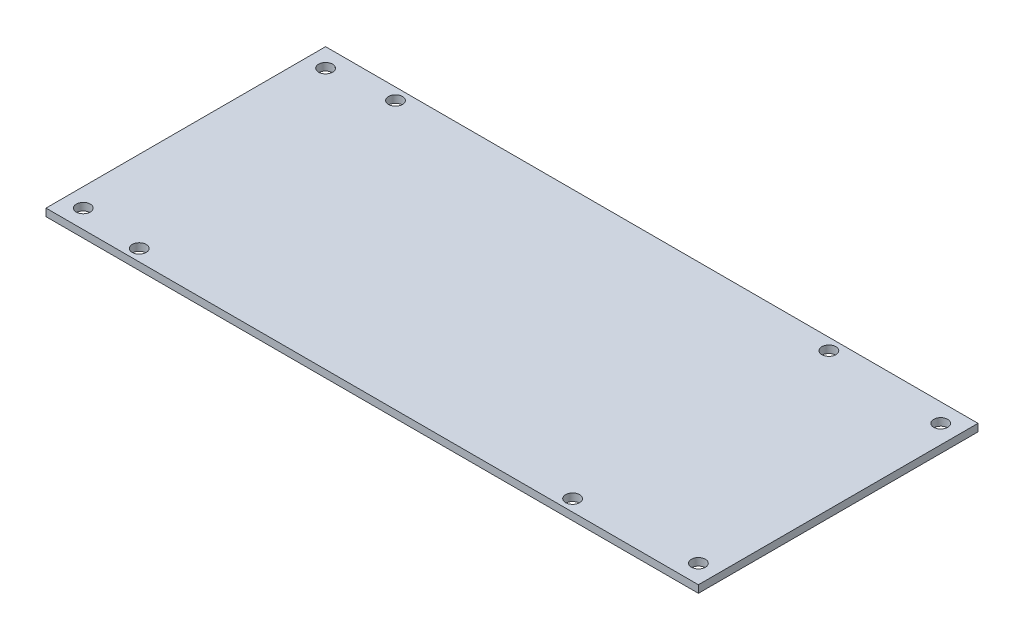
ISO-10303-21;
HEADER;
FILE_DESCRIPTION(('STEP AP214'),'2;1');
FILE_NAME('part.step','',(''),(''),'','','');
FILE_SCHEMA(('AUTOMOTIVE_DESIGN { 1 0 10303 214 1 1 1 1 }'));
ENDSEC;
DATA;
#1=APPLICATION_CONTEXT('core data for automotive mechanical design processes');
#2=APPLICATION_PROTOCOL_DEFINITION('international standard','automotive_design',2000,#1);
#3=PRODUCT_CONTEXT('',#1,'mechanical');
#4=PRODUCT('Part','Part','',(#3));
#5=PRODUCT_RELATED_PRODUCT_CATEGORY('part','',(#4));
#6=PRODUCT_DEFINITION_FORMATION('','',#4);
#7=PRODUCT_DEFINITION_CONTEXT('part definition',#1,'design');
#8=PRODUCT_DEFINITION('design','',#6,#7);
#9=PRODUCT_DEFINITION_SHAPE('','',#8);
#10=(LENGTH_UNIT() NAMED_UNIT(*) SI_UNIT(.MILLI.,.METRE.));
#11=(NAMED_UNIT(*) PLANE_ANGLE_UNIT() SI_UNIT($,.RADIAN.));
#12=(NAMED_UNIT(*) SI_UNIT($,.STERADIAN.) SOLID_ANGLE_UNIT());
#13=UNCERTAINTY_MEASURE_WITH_UNIT(LENGTH_MEASURE(1.E-05),#10,'distance_accuracy_value','');
#14=(GEOMETRIC_REPRESENTATION_CONTEXT(3) GLOBAL_UNCERTAINTY_ASSIGNED_CONTEXT((#13)) GLOBAL_UNIT_ASSIGNED_CONTEXT((#10,
#11,#12)) REPRESENTATION_CONTEXT('',''));
#15=CARTESIAN_POINT('',(0.,0.,0.));
#16=DIRECTION('',(0.,0.,1.));
#17=DIRECTION('',(1.,0.,0.));
#18=AXIS2_PLACEMENT_3D('',#15,#16,#17);
#19=CARTESIAN_POINT('',(70.,1.6,-30.));
#20=DIRECTION('',(-1.,0.,0.));
#21=DIRECTION('',(0.,0.,1.));
#22=AXIS2_PLACEMENT_3D('',#19,#20,#21);
#23=PLANE('',#22);
#24=DIRECTION('',(0.,0.,-1.));
#25=VECTOR('',#24,1.);
#26=CARTESIAN_POINT('',(70.,0.,-30.));
#27=LINE('',#26,#25);
#28=CARTESIAN_POINT('',(70.,0.,30.));
#29=VERTEX_POINT('',#28);
#30=CARTESIAN_POINT('',(70.,0.,-30.));
#31=VERTEX_POINT('',#30);
#32=EDGE_CURVE('E99',#29,#31,#27,.T.);
#33=ORIENTED_EDGE('',*,*,#32,.T.);
#34=DIRECTION('',(0.,-1.,0.));
#35=VECTOR('',#34,1.);
#36=CARTESIAN_POINT('',(70.,1.6,-30.));
#37=LINE('',#36,#35);
#38=CARTESIAN_POINT('',(70.,1.6,-30.));
#39=VERTEX_POINT('',#38);
#40=EDGE_CURVE('E11',#39,#31,#37,.T.);
#41=ORIENTED_EDGE('',*,*,#40,.F.);
#42=DIRECTION('',(0.,0.,-1.));
#43=VECTOR('',#42,1.);
#44=CARTESIAN_POINT('',(70.,1.6,-30.));
#45=LINE('',#44,#43);
#46=CARTESIAN_POINT('',(70.,1.6,30.));
#47=VERTEX_POINT('',#46);
#48=EDGE_CURVE('E87',#47,#39,#45,.T.);
#49=ORIENTED_EDGE('',*,*,#48,.F.);
#50=DIRECTION('',(0.,-1.,0.));
#51=VECTOR('',#50,1.);
#52=CARTESIAN_POINT('',(70.,1.6,30.));
#53=LINE('',#52,#51);
#54=EDGE_CURVE('E95',#47,#29,#53,.T.);
#55=ORIENTED_EDGE('',*,*,#54,.T.);
#56=EDGE_LOOP('',(#33,#41,#49,#55));
#57=FACE_BOUND('',#56,.T.);
#58=ADVANCED_FACE('F36',(#57),#23,.F.);
#59=CARTESIAN_POINT('',(-70.,1.6,-30.));
#60=DIRECTION('',(0.,0.,1.));
#61=DIRECTION('',(1.,0.,0.));
#62=AXIS2_PLACEMENT_3D('',#59,#60,#61);
#63=PLANE('',#62);
#64=DIRECTION('',(-1.,0.,0.));
#65=VECTOR('',#64,1.);
#66=CARTESIAN_POINT('',(-70.,0.,-30.));
#67=LINE('',#66,#65);
#68=CARTESIAN_POINT('',(-70.,0.,-30.));
#69=VERTEX_POINT('',#68);
#70=EDGE_CURVE('E91',#31,#69,#67,.T.);
#71=ORIENTED_EDGE('',*,*,#70,.T.);
#72=DIRECTION('',(0.,-1.,0.));
#73=VECTOR('',#72,1.);
#74=CARTESIAN_POINT('',(-70.,1.6,-30.));
#75=LINE('',#74,#73);
#76=CARTESIAN_POINT('',(-70.,1.6,-30.));
#77=VERTEX_POINT('',#76);
#78=EDGE_CURVE('E44',#77,#69,#75,.T.);
#79=ORIENTED_EDGE('',*,*,#78,.F.);
#80=DIRECTION('',(-1.,0.,0.));
#81=VECTOR('',#80,1.);
#82=CARTESIAN_POINT('',(-70.,1.6,-30.));
#83=LINE('',#82,#81);
#84=EDGE_CURVE('E82',#39,#77,#83,.T.);
#85=ORIENTED_EDGE('',*,*,#84,.F.);
#86=ORIENTED_EDGE('',*,*,#40,.T.);
#87=EDGE_LOOP('',(#71,#79,#85,#86));
#88=FACE_BOUND('',#87,.T.);
#89=ADVANCED_FACE('F90',(#88),#63,.F.);
#90=CARTESIAN_POINT('',(-70.,1.6,-30.));
#91=DIRECTION('',(1.,0.,0.));
#92=DIRECTION('',(0.,0.,-1.));
#93=AXIS2_PLACEMENT_3D('',#90,#91,#92);
#94=PLANE('',#93);
#95=DIRECTION('',(0.,0.,1.));
#96=VECTOR('',#95,1.);
#97=CARTESIAN_POINT('',(-70.,0.,-30.));
#98=LINE('',#97,#96);
#99=CARTESIAN_POINT('',(-70.,0.,30.));
#100=VERTEX_POINT('',#99);
#101=EDGE_CURVE('E69',#69,#100,#98,.T.);
#102=ORIENTED_EDGE('',*,*,#101,.T.);
#103=DIRECTION('',(0.,-1.,0.));
#104=VECTOR('',#103,1.);
#105=CARTESIAN_POINT('',(-70.,1.6,30.));
#106=LINE('',#105,#104);
#107=CARTESIAN_POINT('',(-70.,1.6,30.));
#108=VERTEX_POINT('',#107);
#109=EDGE_CURVE('E92',#108,#100,#106,.T.);
#110=ORIENTED_EDGE('',*,*,#109,.F.);
#111=DIRECTION('',(0.,0.,1.));
#112=VECTOR('',#111,1.);
#113=CARTESIAN_POINT('',(-70.,1.6,-30.));
#114=LINE('',#113,#112);
#115=EDGE_CURVE('E85',#77,#108,#114,.T.);
#116=ORIENTED_EDGE('',*,*,#115,.F.);
#117=ORIENTED_EDGE('',*,*,#78,.T.);
#118=EDGE_LOOP('',(#102,#110,#116,#117));
#119=FACE_BOUND('',#118,.T.);
#120=ADVANCED_FACE('F93',(#119),#94,.F.);
#121=CARTESIAN_POINT('',(-70.,1.6,30.));
#122=DIRECTION('',(0.,0.,-1.));
#123=DIRECTION('',(-1.,0.,0.));
#124=AXIS2_PLACEMENT_3D('',#121,#122,#123);
#125=PLANE('',#124);
#126=DIRECTION('',(1.,0.,0.));
#127=VECTOR('',#126,1.);
#128=CARTESIAN_POINT('',(-70.,0.,30.));
#129=LINE('',#128,#127);
#130=EDGE_CURVE('E75',#100,#29,#129,.T.);
#131=ORIENTED_EDGE('',*,*,#130,.T.);
#132=ORIENTED_EDGE('',*,*,#54,.F.);
#133=DIRECTION('',(1.,0.,0.));
#134=VECTOR('',#133,1.);
#135=CARTESIAN_POINT('',(-70.,1.6,30.));
#136=LINE('',#135,#134);
#137=EDGE_CURVE('E52',#108,#47,#136,.T.);
#138=ORIENTED_EDGE('',*,*,#137,.F.);
#139=ORIENTED_EDGE('',*,*,#109,.T.);
#140=EDGE_LOOP('',(#131,#132,#138,#139));
#141=FACE_BOUND('',#140,.T.);
#142=ADVANCED_FACE('F107',(#141),#125,.F.);
#143=CARTESIAN_POINT('',(0.,1.6,0.));
#144=DIRECTION('',(0.,1.,0.));
#145=DIRECTION('',(0.,0.,1.));
#146=AXIS2_PLACEMENT_3D('',#143,#144,#145);
#147=PLANE('',#146);
#148=CARTESIAN_POINT('',(-52.5,1.6,27.5));
#149=DIRECTION('',(0.,1.,0.));
#150=DIRECTION('',(0.,0.,-1.));
#151=AXIS2_PLACEMENT_3D('',#148,#149,#150);
#152=CIRCLE('',#151,1.5);
#153=CARTESIAN_POINT('',(-52.5,1.6,29.));
#154=VERTEX_POINT('',#153);
#155=EDGE_CURVE('E153',#154,#154,#152,.T.);
#156=ORIENTED_EDGE('',*,*,#155,.F.);
#157=EDGE_LOOP('',(#156));
#158=FACE_BOUND('',#157,.T.);
#159=CARTESIAN_POINT('',(40.5,1.6,-27.5));
#160=DIRECTION('',(0.,1.,0.));
#161=DIRECTION('',(0.,0.,1.));
#162=AXIS2_PLACEMENT_3D('',#159,#160,#161);
#163=CIRCLE('',#162,1.5);
#164=CARTESIAN_POINT('',(40.5,1.6,-26.));
#165=VERTEX_POINT('',#164);
#166=EDGE_CURVE('E146',#165,#165,#163,.T.);
#167=ORIENTED_EDGE('',*,*,#166,.F.);
#168=EDGE_LOOP('',(#167));
#169=FACE_BOUND('',#168,.T.);
#170=CARTESIAN_POINT('',(40.5,1.6,27.5));
#171=DIRECTION('',(0.,1.,0.));
#172=DIRECTION('',(0.,0.,-1.));
#173=AXIS2_PLACEMENT_3D('',#170,#171,#172);
#174=CIRCLE('',#173,1.5);
#175=CARTESIAN_POINT('',(40.5,1.6,29.));
#176=VERTEX_POINT('',#175);
#177=EDGE_CURVE('E147',#176,#176,#174,.T.);
#178=ORIENTED_EDGE('',*,*,#177,.F.);
#179=EDGE_LOOP('',(#178));
#180=FACE_BOUND('',#179,.T.);
#181=CARTESIAN_POINT('',(-52.5,1.6,-27.5));
#182=DIRECTION('',(0.,1.,0.));
#183=DIRECTION('',(0.,0.,1.));
#184=AXIS2_PLACEMENT_3D('',#181,#182,#183);
#185=CIRCLE('',#184,1.5);
#186=CARTESIAN_POINT('',(-52.5,1.6,-26.));
#187=VERTEX_POINT('',#186);
#188=EDGE_CURVE('E139',#187,#187,#185,.T.);
#189=ORIENTED_EDGE('',*,*,#188,.F.);
#190=EDGE_LOOP('',(#189));
#191=FACE_BOUND('',#190,.T.);
#192=CARTESIAN_POINT('',(-66.,1.6,26.));
#193=DIRECTION('',(0.,1.,0.));
#194=DIRECTION('',(0.,0.,-1.));
#195=AXIS2_PLACEMENT_3D('',#192,#193,#194);
#196=CIRCLE('',#195,1.5);
#197=CARTESIAN_POINT('',(-66.,1.6,24.5));
#198=VERTEX_POINT('',#197);
#199=EDGE_CURVE('E130',#198,#198,#196,.T.);
#200=ORIENTED_EDGE('',*,*,#199,.F.);
#201=EDGE_LOOP('',(#200));
#202=FACE_BOUND('',#201,.T.);
#203=CARTESIAN_POINT('',(66.,1.6,26.));
#204=DIRECTION('',(0.,1.,0.));
#205=DIRECTION('',(0.,0.,1.));
#206=AXIS2_PLACEMENT_3D('',#203,#204,#205);
#207=CIRCLE('',#206,1.5);
#208=CARTESIAN_POINT('',(66.,1.6,27.5));
#209=VERTEX_POINT('',#208);
#210=EDGE_CURVE('E122',#209,#209,#207,.T.);
#211=ORIENTED_EDGE('',*,*,#210,.F.);
#212=EDGE_LOOP('',(#211));
#213=FACE_BOUND('',#212,.T.);
#214=CARTESIAN_POINT('',(66.,1.6,-26.));
#215=DIRECTION('',(0.,1.,0.));
#216=DIRECTION('',(0.,0.,-1.));
#217=AXIS2_PLACEMENT_3D('',#214,#215,#216);
#218=CIRCLE('',#217,1.5);
#219=CARTESIAN_POINT('',(66.,1.6,-27.5));
#220=VERTEX_POINT('',#219);
#221=EDGE_CURVE('E123',#220,#220,#218,.T.);
#222=ORIENTED_EDGE('',*,*,#221,.F.);
#223=EDGE_LOOP('',(#222));
#224=FACE_BOUND('',#223,.T.);
#225=CARTESIAN_POINT('',(-66.,1.6,-26.));
#226=DIRECTION('',(0.,1.,0.));
#227=DIRECTION('',(0.,0.,1.));
#228=AXIS2_PLACEMENT_3D('',#225,#226,#227);
#229=CIRCLE('',#228,1.5);
#230=CARTESIAN_POINT('',(-66.,1.6,-24.5));
#231=VERTEX_POINT('',#230);
#232=EDGE_CURVE('E115',#231,#231,#229,.T.);
#233=ORIENTED_EDGE('',*,*,#232,.F.);
#234=EDGE_LOOP('',(#233));
#235=FACE_BOUND('',#234,.T.);
#236=ORIENTED_EDGE('',*,*,#48,.T.);
#237=ORIENTED_EDGE('',*,*,#84,.T.);
#238=ORIENTED_EDGE('',*,*,#115,.T.);
#239=ORIENTED_EDGE('',*,*,#137,.T.);
#240=EDGE_LOOP('',(#236,#237,#238,#239));
#241=FACE_BOUND('',#240,.T.);
#242=ADVANCED_FACE('F83',(#158,#169,#180,#191,#202,#213,#224,#235,#241),#147,.T.);
#243=CARTESIAN_POINT('',(0.,0.,0.));
#244=DIRECTION('',(0.,1.,0.));
#245=DIRECTION('',(0.,0.,1.));
#246=AXIS2_PLACEMENT_3D('',#243,#244,#245);
#247=PLANE('',#246);
#248=CARTESIAN_POINT('',(-52.5,0.,27.5));
#249=DIRECTION('',(0.,1.,0.));
#250=DIRECTION('',(0.,0.,1.));
#251=AXIS2_PLACEMENT_3D('',#248,#249,#250);
#252=CIRCLE('',#251,1.5);
#253=CARTESIAN_POINT('',(-52.5,0.,29.));
#254=VERTEX_POINT('',#253);
#255=EDGE_CURVE('E142',#254,#254,#252,.F.);
#256=ORIENTED_EDGE('',*,*,#255,.F.);
#257=EDGE_LOOP('',(#256));
#258=FACE_BOUND('',#257,.T.);
#259=CARTESIAN_POINT('',(40.5,0.,-27.5));
#260=DIRECTION('',(0.,1.,0.));
#261=DIRECTION('',(0.,0.,1.));
#262=AXIS2_PLACEMENT_3D('',#259,#260,#261);
#263=CIRCLE('',#262,1.5);
#264=CARTESIAN_POINT('',(40.5,0.,-26.));
#265=VERTEX_POINT('',#264);
#266=EDGE_CURVE('E150',#265,#265,#263,.F.);
#267=ORIENTED_EDGE('',*,*,#266,.F.);
#268=EDGE_LOOP('',(#267));
#269=FACE_BOUND('',#268,.T.);
#270=CARTESIAN_POINT('',(40.5,0.,27.5));
#271=DIRECTION('',(0.,1.,0.));
#272=DIRECTION('',(0.,0.,1.));
#273=AXIS2_PLACEMENT_3D('',#270,#271,#272);
#274=CIRCLE('',#273,1.5);
#275=CARTESIAN_POINT('',(40.5,0.,29.));
#276=VERTEX_POINT('',#275);
#277=EDGE_CURVE('E143',#276,#276,#274,.F.);
#278=ORIENTED_EDGE('',*,*,#277,.F.);
#279=EDGE_LOOP('',(#278));
#280=FACE_BOUND('',#279,.T.);
#281=CARTESIAN_POINT('',(-52.5,0.,-27.5));
#282=DIRECTION('',(0.,1.,0.));
#283=DIRECTION('',(0.,0.,1.));
#284=AXIS2_PLACEMENT_3D('',#281,#282,#283);
#285=CIRCLE('',#284,1.5);
#286=CARTESIAN_POINT('',(-52.5,0.,-26.));
#287=VERTEX_POINT('',#286);
#288=EDGE_CURVE('E126',#287,#287,#285,.F.);
#289=ORIENTED_EDGE('',*,*,#288,.F.);
#290=EDGE_LOOP('',(#289));
#291=FACE_BOUND('',#290,.T.);
#292=CARTESIAN_POINT('',(-66.,0.,26.));
#293=DIRECTION('',(0.,1.,0.));
#294=DIRECTION('',(0.,0.,1.));
#295=AXIS2_PLACEMENT_3D('',#292,#293,#294);
#296=CIRCLE('',#295,1.5);
#297=CARTESIAN_POINT('',(-66.,0.,27.5));
#298=VERTEX_POINT('',#297);
#299=EDGE_CURVE('E118',#298,#298,#296,.F.);
#300=ORIENTED_EDGE('',*,*,#299,.F.);
#301=EDGE_LOOP('',(#300));
#302=FACE_BOUND('',#301,.T.);
#303=CARTESIAN_POINT('',(66.,0.,26.));
#304=DIRECTION('',(0.,1.,0.));
#305=DIRECTION('',(0.,0.,1.));
#306=AXIS2_PLACEMENT_3D('',#303,#304,#305);
#307=CIRCLE('',#306,1.5);
#308=CARTESIAN_POINT('',(66.,0.,27.5));
#309=VERTEX_POINT('',#308);
#310=EDGE_CURVE('E127',#309,#309,#307,.F.);
#311=ORIENTED_EDGE('',*,*,#310,.F.);
#312=EDGE_LOOP('',(#311));
#313=FACE_BOUND('',#312,.T.);
#314=CARTESIAN_POINT('',(66.,0.,-26.));
#315=DIRECTION('',(0.,1.,0.));
#316=DIRECTION('',(0.,0.,1.));
#317=AXIS2_PLACEMENT_3D('',#314,#315,#316);
#318=CIRCLE('',#317,1.5);
#319=CARTESIAN_POINT('',(66.,0.,-24.5));
#320=VERTEX_POINT('',#319);
#321=EDGE_CURVE('E119',#320,#320,#318,.F.);
#322=ORIENTED_EDGE('',*,*,#321,.F.);
#323=EDGE_LOOP('',(#322));
#324=FACE_BOUND('',#323,.T.);
#325=CARTESIAN_POINT('',(-66.,0.,-26.));
#326=DIRECTION('',(0.,1.,0.));
#327=DIRECTION('',(0.,0.,1.));
#328=AXIS2_PLACEMENT_3D('',#325,#326,#327);
#329=CIRCLE('',#328,1.5);
#330=CARTESIAN_POINT('',(-66.,0.,-24.5));
#331=VERTEX_POINT('',#330);
#332=EDGE_CURVE('E102',#331,#331,#329,.F.);
#333=ORIENTED_EDGE('',*,*,#332,.F.);
#334=EDGE_LOOP('',(#333));
#335=FACE_BOUND('',#334,.T.);
#336=ORIENTED_EDGE('',*,*,#32,.F.);
#337=ORIENTED_EDGE('',*,*,#130,.F.);
#338=ORIENTED_EDGE('',*,*,#101,.F.);
#339=ORIENTED_EDGE('',*,*,#70,.F.);
#340=EDGE_LOOP('',(#336,#337,#338,#339));
#341=FACE_BOUND('',#340,.T.);
#342=ADVANCED_FACE('F110',(#258,#269,#280,#291,#302,#313,#324,#335,#341),#247,.F.);
#343=CARTESIAN_POINT('',(-66.,-4.24264068711928,-26.));
#344=DIRECTION('',(0.,1.,0.));
#345=DIRECTION('',(0.,0.,1.));
#346=AXIS2_PLACEMENT_3D('',#343,#344,#345);
#347=CYLINDRICAL_SURFACE('',#346,1.5);
#348=ORIENTED_EDGE('',*,*,#332,.T.);
#349=EDGE_LOOP('',(#348));
#350=FACE_BOUND('',#349,.T.);
#351=ORIENTED_EDGE('',*,*,#232,.T.);
#352=EDGE_LOOP('',(#351));
#353=FACE_BOUND('',#352,.T.);
#354=ADVANCED_FACE('F180',(#350,#353),#347,.F.);
#355=CARTESIAN_POINT('',(66.,-4.24264068711928,-26.));
#356=DIRECTION('',(0.,1.,0.));
#357=DIRECTION('',(0.,0.,1.));
#358=AXIS2_PLACEMENT_3D('',#355,#356,#357);
#359=CYLINDRICAL_SURFACE('',#358,1.5);
#360=ORIENTED_EDGE('',*,*,#321,.T.);
#361=EDGE_LOOP('',(#360));
#362=FACE_BOUND('',#361,.T.);
#363=ORIENTED_EDGE('',*,*,#221,.T.);
#364=EDGE_LOOP('',(#363));
#365=FACE_BOUND('',#364,.T.);
#366=ADVANCED_FACE('F182',(#362,#365),#359,.F.);
#367=CARTESIAN_POINT('',(66.,-4.24264068711928,26.));
#368=DIRECTION('',(0.,1.,0.));
#369=DIRECTION('',(0.,0.,1.));
#370=AXIS2_PLACEMENT_3D('',#367,#368,#369);
#371=CYLINDRICAL_SURFACE('',#370,1.5);
#372=ORIENTED_EDGE('',*,*,#310,.T.);
#373=EDGE_LOOP('',(#372));
#374=FACE_BOUND('',#373,.T.);
#375=ORIENTED_EDGE('',*,*,#210,.T.);
#376=EDGE_LOOP('',(#375));
#377=FACE_BOUND('',#376,.T.);
#378=ADVANCED_FACE('F189',(#374,#377),#371,.F.);
#379=CARTESIAN_POINT('',(-66.,-4.24264068711928,26.));
#380=DIRECTION('',(0.,1.,0.));
#381=DIRECTION('',(0.,0.,1.));
#382=AXIS2_PLACEMENT_3D('',#379,#380,#381);
#383=CYLINDRICAL_SURFACE('',#382,1.5);
#384=ORIENTED_EDGE('',*,*,#299,.T.);
#385=EDGE_LOOP('',(#384));
#386=FACE_BOUND('',#385,.T.);
#387=ORIENTED_EDGE('',*,*,#199,.T.);
#388=EDGE_LOOP('',(#387));
#389=FACE_BOUND('',#388,.T.);
#390=ADVANCED_FACE('F229',(#386,#389),#383,.F.);
#391=CARTESIAN_POINT('',(-52.5,-4.24264068711929,-27.5));
#392=DIRECTION('',(0.,1.,0.));
#393=DIRECTION('',(0.,0.,1.));
#394=AXIS2_PLACEMENT_3D('',#391,#392,#393);
#395=CYLINDRICAL_SURFACE('',#394,1.5);
#396=CARTESIAN_POINT('',(-52.5,0.,-26.));
#397=CARTESIAN_POINT('',(-52.5,0.0166666666666666,-26.));
#398=CARTESIAN_POINT('',(-52.5,0.0333333333333331,-26.));
#399=CARTESIAN_POINT('',(-52.5,0.0666666666666666,-26.));
#400=CARTESIAN_POINT('',(-52.5,0.0833333333333334,-26.));
#401=CARTESIAN_POINT('',(-52.5,0.116666666666667,-26.));
#402=CARTESIAN_POINT('',(-52.5,0.133333333333333,-26.));
#403=CARTESIAN_POINT('',(-52.5,0.166666666666667,-26.));
#404=CARTESIAN_POINT('',(-52.5,0.183333333333334,-26.));
#405=CARTESIAN_POINT('',(-52.5,0.216666666666667,-26.));
#406=CARTESIAN_POINT('',(-52.5,0.233333333333334,-26.));
#407=CARTESIAN_POINT('',(-52.5,0.266666666666667,-26.));
#408=CARTESIAN_POINT('',(-52.5,0.283333333333333,-26.));
#409=CARTESIAN_POINT('',(-52.5,0.316666666666667,-26.));
#410=CARTESIAN_POINT('',(-52.5,0.333333333333334,-26.));
#411=CARTESIAN_POINT('',(-52.5,0.366666666666667,-26.));
#412=CARTESIAN_POINT('',(-52.5,0.383333333333334,-26.));
#413=CARTESIAN_POINT('',(-52.5,0.416666666666667,-26.));
#414=CARTESIAN_POINT('',(-52.5,0.433333333333333,-26.));
#415=CARTESIAN_POINT('',(-52.5,0.466666666666667,-26.));
#416=CARTESIAN_POINT('',(-52.5,0.483333333333334,-26.));
#417=CARTESIAN_POINT('',(-52.5,0.516666666666667,-26.));
#418=CARTESIAN_POINT('',(-52.5,0.533333333333334,-26.));
#419=CARTESIAN_POINT('',(-52.5,0.566666666666667,-26.));
#420=CARTESIAN_POINT('',(-52.5,0.583333333333333,-26.));
#421=CARTESIAN_POINT('',(-52.5,0.616666666666667,-26.));
#422=CARTESIAN_POINT('',(-52.5,0.633333333333334,-26.));
#423=CARTESIAN_POINT('',(-52.5,0.666666666666667,-26.));
#424=CARTESIAN_POINT('',(-52.5,0.683333333333334,-26.));
#425=CARTESIAN_POINT('',(-52.5,0.716666666666667,-26.));
#426=CARTESIAN_POINT('',(-52.5,0.733333333333334,-26.));
#427=CARTESIAN_POINT('',(-52.5,0.766666666666667,-26.));
#428=CARTESIAN_POINT('',(-52.5,0.783333333333334,-26.));
#429=CARTESIAN_POINT('',(-52.5,0.816666666666667,-26.));
#430=CARTESIAN_POINT('',(-52.5,0.833333333333333,-26.));
#431=CARTESIAN_POINT('',(-52.5,0.866666666666667,-26.));
#432=CARTESIAN_POINT('',(-52.5,0.883333333333334,-26.));
#433=CARTESIAN_POINT('',(-52.5,0.916666666666667,-26.));
#434=CARTESIAN_POINT('',(-52.5,0.933333333333334,-26.));
#435=CARTESIAN_POINT('',(-52.5,0.966666666666667,-26.));
#436=CARTESIAN_POINT('',(-52.5,0.983333333333334,-26.));
#437=CARTESIAN_POINT('',(-52.5,1.01666666666667,-26.));
#438=CARTESIAN_POINT('',(-52.5,1.03333333333333,-26.));
#439=CARTESIAN_POINT('',(-52.5,1.06666666666667,-26.));
#440=CARTESIAN_POINT('',(-52.5,1.08333333333333,-26.));
#441=CARTESIAN_POINT('',(-52.5,1.11666666666667,-26.));
#442=CARTESIAN_POINT('',(-52.5,1.13333333333333,-26.));
#443=CARTESIAN_POINT('',(-52.5,1.16666666666667,-26.));
#444=CARTESIAN_POINT('',(-52.5,1.18333333333333,-26.));
#445=CARTESIAN_POINT('',(-52.5,1.21666666666667,-26.));
#446=CARTESIAN_POINT('',(-52.5,1.23333333333333,-26.));
#447=CARTESIAN_POINT('',(-52.5,1.26666666666667,-26.));
#448=CARTESIAN_POINT('',(-52.5,1.28333333333333,-26.));
#449=CARTESIAN_POINT('',(-52.5,1.31666666666667,-26.));
#450=CARTESIAN_POINT('',(-52.5,1.33333333333333,-26.));
#451=CARTESIAN_POINT('',(-52.5,1.36666666666667,-26.));
#452=CARTESIAN_POINT('',(-52.5,1.38333333333333,-26.));
#453=CARTESIAN_POINT('',(-52.5,1.41666666666667,-26.));
#454=CARTESIAN_POINT('',(-52.5,1.43333333333333,-26.));
#455=CARTESIAN_POINT('',(-52.5,1.46666666666667,-26.));
#456=CARTESIAN_POINT('',(-52.5,1.48333333333333,-26.));
#457=CARTESIAN_POINT('',(-52.5,1.51666666666667,-26.));
#458=CARTESIAN_POINT('',(-52.5,1.53333333333333,-26.));
#459=CARTESIAN_POINT('',(-52.5,1.56666666666667,-26.));
#460=CARTESIAN_POINT('',(-52.5,1.58333333333333,-26.));
#461=CARTESIAN_POINT('',(-52.5,1.6,-26.));
#462=B_SPLINE_CURVE_WITH_KNOTS('',3,(#396,#397,#398,#399,#400,#401,#402,#403,#404,#405,#406,
#407,#408,#409,#410,#411,#412,#413,#414,#415,#416,#417,#418,#419,#420,#421,#422,#423,#424,#425,
#426,#427,#428,#429,#430,#431,#432,#433,#434,#435,#436,#437,#438,#439,#440,#441,#442,#443,#444,
#445,#446,#447,#448,#449,#450,#451,#452,#453,#454,#455,#456,#457,#458,#459,#460,#461),
.UNSPECIFIED.,.F.,.F.,(4,2,2,2,2,2,2,2,2,2,2,2,2,2,2,2,2,2,2,2,2,2,2,2,2,2,2,2,2,2,2,2,4),(0.,
0.0499999999999997,0.1,0.15,0.200000000000001,0.25,0.3,0.35,0.4,0.45,0.5,0.55,0.6,0.65,0.7,
0.750000000000001,0.8,0.85,0.900000000000001,0.95,1.,1.05,1.1,1.15,1.2,1.25,1.3,1.35,1.4,1.45,
1.5,1.55,1.6),.UNSPECIFIED.);
#463=EDGE_CURVE('BSEAM223',#287,#187,#462,.T.);
#464=ORIENTED_EDGE('',*,*,#288,.T.);
#465=ORIENTED_EDGE('',*,*,#188,.T.);
#466=ORIENTED_EDGE('',*,*,#463,.T.);
#467=ORIENTED_EDGE('',*,*,#463,.F.);
#468=EDGE_LOOP('',(#464,#466,#465,#467));
#469=FACE_BOUND('',#468,.T.);
#470=ADVANCED_FACE('F223',(#469),#395,.F.);
#471=CARTESIAN_POINT('',(40.5,-4.24264068711929,27.5));
#472=DIRECTION('',(0.,1.,0.));
#473=DIRECTION('',(0.,0.,1.));
#474=AXIS2_PLACEMENT_3D('',#471,#472,#473);
#475=CYLINDRICAL_SURFACE('',#474,1.5);
#476=CARTESIAN_POINT('',(40.5,0.,29.));
#477=CARTESIAN_POINT('',(40.5,0.0166666666666666,29.));
#478=CARTESIAN_POINT('',(40.5,0.0333333333333331,29.));
#479=CARTESIAN_POINT('',(40.5,0.0666666666666666,29.));
#480=CARTESIAN_POINT('',(40.5,0.0833333333333334,29.));
#481=CARTESIAN_POINT('',(40.5,0.116666666666667,29.));
#482=CARTESIAN_POINT('',(40.5,0.133333333333333,29.));
#483=CARTESIAN_POINT('',(40.5,0.166666666666667,29.));
#484=CARTESIAN_POINT('',(40.5,0.183333333333334,29.));
#485=CARTESIAN_POINT('',(40.5,0.216666666666667,29.));
#486=CARTESIAN_POINT('',(40.5,0.233333333333334,29.));
#487=CARTESIAN_POINT('',(40.5,0.266666666666667,29.));
#488=CARTESIAN_POINT('',(40.5,0.283333333333333,29.));
#489=CARTESIAN_POINT('',(40.5,0.316666666666667,29.));
#490=CARTESIAN_POINT('',(40.5,0.333333333333334,29.));
#491=CARTESIAN_POINT('',(40.5,0.366666666666667,29.));
#492=CARTESIAN_POINT('',(40.5,0.383333333333334,29.));
#493=CARTESIAN_POINT('',(40.5,0.416666666666667,29.));
#494=CARTESIAN_POINT('',(40.5,0.433333333333333,29.));
#495=CARTESIAN_POINT('',(40.5,0.466666666666667,29.));
#496=CARTESIAN_POINT('',(40.5,0.483333333333334,29.));
#497=CARTESIAN_POINT('',(40.5,0.516666666666667,29.));
#498=CARTESIAN_POINT('',(40.5,0.533333333333334,29.));
#499=CARTESIAN_POINT('',(40.5,0.566666666666667,29.));
#500=CARTESIAN_POINT('',(40.5,0.583333333333333,29.));
#501=CARTESIAN_POINT('',(40.5,0.616666666666667,29.));
#502=CARTESIAN_POINT('',(40.5,0.633333333333334,29.));
#503=CARTESIAN_POINT('',(40.5,0.666666666666667,29.));
#504=CARTESIAN_POINT('',(40.5,0.683333333333334,29.));
#505=CARTESIAN_POINT('',(40.5,0.716666666666667,29.));
#506=CARTESIAN_POINT('',(40.5,0.733333333333334,29.));
#507=CARTESIAN_POINT('',(40.5,0.766666666666667,29.));
#508=CARTESIAN_POINT('',(40.5,0.783333333333334,29.));
#509=CARTESIAN_POINT('',(40.5,0.816666666666667,29.));
#510=CARTESIAN_POINT('',(40.5,0.833333333333333,29.));
#511=CARTESIAN_POINT('',(40.5,0.866666666666667,29.));
#512=CARTESIAN_POINT('',(40.5,0.883333333333334,29.));
#513=CARTESIAN_POINT('',(40.5,0.916666666666667,29.));
#514=CARTESIAN_POINT('',(40.5,0.933333333333334,29.));
#515=CARTESIAN_POINT('',(40.5,0.966666666666667,29.));
#516=CARTESIAN_POINT('',(40.5,0.983333333333334,29.));
#517=CARTESIAN_POINT('',(40.5,1.01666666666667,29.));
#518=CARTESIAN_POINT('',(40.5,1.03333333333333,29.));
#519=CARTESIAN_POINT('',(40.5,1.06666666666667,29.));
#520=CARTESIAN_POINT('',(40.5,1.08333333333333,29.));
#521=CARTESIAN_POINT('',(40.5,1.11666666666667,29.));
#522=CARTESIAN_POINT('',(40.5,1.13333333333333,29.));
#523=CARTESIAN_POINT('',(40.5,1.16666666666667,29.));
#524=CARTESIAN_POINT('',(40.5,1.18333333333333,29.));
#525=CARTESIAN_POINT('',(40.5,1.21666666666667,29.));
#526=CARTESIAN_POINT('',(40.5,1.23333333333333,29.));
#527=CARTESIAN_POINT('',(40.5,1.26666666666667,29.));
#528=CARTESIAN_POINT('',(40.5,1.28333333333333,29.));
#529=CARTESIAN_POINT('',(40.5,1.31666666666667,29.));
#530=CARTESIAN_POINT('',(40.5,1.33333333333333,29.));
#531=CARTESIAN_POINT('',(40.5,1.36666666666667,29.));
#532=CARTESIAN_POINT('',(40.5,1.38333333333333,29.));
#533=CARTESIAN_POINT('',(40.5,1.41666666666667,29.));
#534=CARTESIAN_POINT('',(40.5,1.43333333333333,29.));
#535=CARTESIAN_POINT('',(40.5,1.46666666666667,29.));
#536=CARTESIAN_POINT('',(40.5,1.48333333333333,29.));
#537=CARTESIAN_POINT('',(40.5,1.51666666666667,29.));
#538=CARTESIAN_POINT('',(40.5,1.53333333333333,29.));
#539=CARTESIAN_POINT('',(40.5,1.56666666666667,29.));
#540=CARTESIAN_POINT('',(40.5,1.58333333333333,29.));
#541=CARTESIAN_POINT('',(40.5,1.6,29.));
#542=B_SPLINE_CURVE_WITH_KNOTS('',3,(#476,#477,#478,#479,#480,#481,#482,#483,#484,#485,#486,
#487,#488,#489,#490,#491,#492,#493,#494,#495,#496,#497,#498,#499,#500,#501,#502,#503,#504,#505,
#506,#507,#508,#509,#510,#511,#512,#513,#514,#515,#516,#517,#518,#519,#520,#521,#522,#523,#524,
#525,#526,#527,#528,#529,#530,#531,#532,#533,#534,#535,#536,#537,#538,#539,#540,#541),
.UNSPECIFIED.,.F.,.F.,(4,2,2,2,2,2,2,2,2,2,2,2,2,2,2,2,2,2,2,2,2,2,2,2,2,2,2,2,2,2,2,2,4),(0.,
0.0499999999999997,0.1,0.15,0.200000000000001,0.25,0.3,0.35,0.4,0.45,0.5,0.55,0.6,0.65,0.7,
0.750000000000001,0.8,0.85,0.900000000000001,0.95,1.,1.05,1.1,1.15,1.2,1.25,1.3,1.35,1.4,1.45,
1.5,1.55,1.6),.UNSPECIFIED.);
#543=EDGE_CURVE('BSEAM228',#276,#176,#542,.T.);
#544=ORIENTED_EDGE('',*,*,#277,.T.);
#545=ORIENTED_EDGE('',*,*,#177,.T.);
#546=ORIENTED_EDGE('',*,*,#543,.T.);
#547=ORIENTED_EDGE('',*,*,#543,.F.);
#548=EDGE_LOOP('',(#544,#546,#545,#547));
#549=FACE_BOUND('',#548,.T.);
#550=ADVANCED_FACE('F228',(#549),#475,.F.);
#551=CARTESIAN_POINT('',(40.5,-4.24264068711929,-27.5));
#552=DIRECTION('',(0.,1.,0.));
#553=DIRECTION('',(0.,0.,1.));
#554=AXIS2_PLACEMENT_3D('',#551,#552,#553);
#555=CYLINDRICAL_SURFACE('',#554,1.5);
#556=CARTESIAN_POINT('',(40.5,0.,-26.));
#557=CARTESIAN_POINT('',(40.5,0.0166666666666666,-26.));
#558=CARTESIAN_POINT('',(40.5,0.0333333333333331,-26.));
#559=CARTESIAN_POINT('',(40.5,0.0666666666666666,-26.));
#560=CARTESIAN_POINT('',(40.5,0.0833333333333334,-26.));
#561=CARTESIAN_POINT('',(40.5,0.116666666666667,-26.));
#562=CARTESIAN_POINT('',(40.5,0.133333333333333,-26.));
#563=CARTESIAN_POINT('',(40.5,0.166666666666667,-26.));
#564=CARTESIAN_POINT('',(40.5,0.183333333333334,-26.));
#565=CARTESIAN_POINT('',(40.5,0.216666666666667,-26.));
#566=CARTESIAN_POINT('',(40.5,0.233333333333334,-26.));
#567=CARTESIAN_POINT('',(40.5,0.266666666666667,-26.));
#568=CARTESIAN_POINT('',(40.5,0.283333333333333,-26.));
#569=CARTESIAN_POINT('',(40.5,0.316666666666667,-26.));
#570=CARTESIAN_POINT('',(40.5,0.333333333333334,-26.));
#571=CARTESIAN_POINT('',(40.5,0.366666666666667,-26.));
#572=CARTESIAN_POINT('',(40.5,0.383333333333334,-26.));
#573=CARTESIAN_POINT('',(40.5,0.416666666666667,-26.));
#574=CARTESIAN_POINT('',(40.5,0.433333333333333,-26.));
#575=CARTESIAN_POINT('',(40.5,0.466666666666667,-26.));
#576=CARTESIAN_POINT('',(40.5,0.483333333333334,-26.));
#577=CARTESIAN_POINT('',(40.5,0.516666666666667,-26.));
#578=CARTESIAN_POINT('',(40.5,0.533333333333334,-26.));
#579=CARTESIAN_POINT('',(40.5,0.566666666666667,-26.));
#580=CARTESIAN_POINT('',(40.5,0.583333333333333,-26.));
#581=CARTESIAN_POINT('',(40.5,0.616666666666667,-26.));
#582=CARTESIAN_POINT('',(40.5,0.633333333333334,-26.));
#583=CARTESIAN_POINT('',(40.5,0.666666666666667,-26.));
#584=CARTESIAN_POINT('',(40.5,0.683333333333334,-26.));
#585=CARTESIAN_POINT('',(40.5,0.716666666666667,-26.));
#586=CARTESIAN_POINT('',(40.5,0.733333333333334,-26.));
#587=CARTESIAN_POINT('',(40.5,0.766666666666667,-26.));
#588=CARTESIAN_POINT('',(40.5,0.783333333333334,-26.));
#589=CARTESIAN_POINT('',(40.5,0.816666666666667,-26.));
#590=CARTESIAN_POINT('',(40.5,0.833333333333333,-26.));
#591=CARTESIAN_POINT('',(40.5,0.866666666666667,-26.));
#592=CARTESIAN_POINT('',(40.5,0.883333333333334,-26.));
#593=CARTESIAN_POINT('',(40.5,0.916666666666667,-26.));
#594=CARTESIAN_POINT('',(40.5,0.933333333333334,-26.));
#595=CARTESIAN_POINT('',(40.5,0.966666666666667,-26.));
#596=CARTESIAN_POINT('',(40.5,0.983333333333334,-26.));
#597=CARTESIAN_POINT('',(40.5,1.01666666666667,-26.));
#598=CARTESIAN_POINT('',(40.5,1.03333333333333,-26.));
#599=CARTESIAN_POINT('',(40.5,1.06666666666667,-26.));
#600=CARTESIAN_POINT('',(40.5,1.08333333333333,-26.));
#601=CARTESIAN_POINT('',(40.5,1.11666666666667,-26.));
#602=CARTESIAN_POINT('',(40.5,1.13333333333333,-26.));
#603=CARTESIAN_POINT('',(40.5,1.16666666666667,-26.));
#604=CARTESIAN_POINT('',(40.5,1.18333333333333,-26.));
#605=CARTESIAN_POINT('',(40.5,1.21666666666667,-26.));
#606=CARTESIAN_POINT('',(40.5,1.23333333333333,-26.));
#607=CARTESIAN_POINT('',(40.5,1.26666666666667,-26.));
#608=CARTESIAN_POINT('',(40.5,1.28333333333333,-26.));
#609=CARTESIAN_POINT('',(40.5,1.31666666666667,-26.));
#610=CARTESIAN_POINT('',(40.5,1.33333333333333,-26.));
#611=CARTESIAN_POINT('',(40.5,1.36666666666667,-26.));
#612=CARTESIAN_POINT('',(40.5,1.38333333333333,-26.));
#613=CARTESIAN_POINT('',(40.5,1.41666666666667,-26.));
#614=CARTESIAN_POINT('',(40.5,1.43333333333333,-26.));
#615=CARTESIAN_POINT('',(40.5,1.46666666666667,-26.));
#616=CARTESIAN_POINT('',(40.5,1.48333333333333,-26.));
#617=CARTESIAN_POINT('',(40.5,1.51666666666667,-26.));
#618=CARTESIAN_POINT('',(40.5,1.53333333333333,-26.));
#619=CARTESIAN_POINT('',(40.5,1.56666666666667,-26.));
#620=CARTESIAN_POINT('',(40.5,1.58333333333333,-26.));
#621=CARTESIAN_POINT('',(40.5,1.6,-26.));
#622=B_SPLINE_CURVE_WITH_KNOTS('',3,(#556,#557,#558,#559,#560,#561,#562,#563,#564,#565,#566,
#567,#568,#569,#570,#571,#572,#573,#574,#575,#576,#577,#578,#579,#580,#581,#582,#583,#584,#585,
#586,#587,#588,#589,#590,#591,#592,#593,#594,#595,#596,#597,#598,#599,#600,#601,#602,#603,#604,
#605,#606,#607,#608,#609,#610,#611,#612,#613,#614,#615,#616,#617,#618,#619,#620,#621),
.UNSPECIFIED.,.F.,.F.,(4,2,2,2,2,2,2,2,2,2,2,2,2,2,2,2,2,2,2,2,2,2,2,2,2,2,2,2,2,2,2,2,4),(0.,
0.0499999999999997,0.1,0.15,0.200000000000001,0.25,0.3,0.35,0.4,0.45,0.5,0.55,0.6,0.65,0.7,
0.750000000000001,0.8,0.85,0.900000000000001,0.95,1.,1.05,1.1,1.15,1.2,1.25,1.3,1.35,1.4,1.45,
1.5,1.55,1.6),.UNSPECIFIED.);
#623=EDGE_CURVE('BSEAM241',#265,#165,#622,.T.);
#624=ORIENTED_EDGE('',*,*,#266,.T.);
#625=ORIENTED_EDGE('',*,*,#166,.T.);
#626=ORIENTED_EDGE('',*,*,#623,.T.);
#627=ORIENTED_EDGE('',*,*,#623,.F.);
#628=EDGE_LOOP('',(#624,#626,#625,#627));
#629=FACE_BOUND('',#628,.T.);
#630=ADVANCED_FACE('F241',(#629),#555,.F.);
#631=CARTESIAN_POINT('',(-52.5,-4.24264068711929,27.5));
#632=DIRECTION('',(0.,1.,0.));
#633=DIRECTION('',(0.,0.,1.));
#634=AXIS2_PLACEMENT_3D('',#631,#632,#633);
#635=CYLINDRICAL_SURFACE('',#634,1.5);
#636=CARTESIAN_POINT('',(-52.5,0.,29.));
#637=CARTESIAN_POINT('',(-52.5,0.0166666666666666,29.));
#638=CARTESIAN_POINT('',(-52.5,0.0333333333333331,29.));
#639=CARTESIAN_POINT('',(-52.5,0.0666666666666666,29.));
#640=CARTESIAN_POINT('',(-52.5,0.0833333333333334,29.));
#641=CARTESIAN_POINT('',(-52.5,0.116666666666667,29.));
#642=CARTESIAN_POINT('',(-52.5,0.133333333333333,29.));
#643=CARTESIAN_POINT('',(-52.5,0.166666666666667,29.));
#644=CARTESIAN_POINT('',(-52.5,0.183333333333334,29.));
#645=CARTESIAN_POINT('',(-52.5,0.216666666666667,29.));
#646=CARTESIAN_POINT('',(-52.5,0.233333333333334,29.));
#647=CARTESIAN_POINT('',(-52.5,0.266666666666667,29.));
#648=CARTESIAN_POINT('',(-52.5,0.283333333333333,29.));
#649=CARTESIAN_POINT('',(-52.5,0.316666666666667,29.));
#650=CARTESIAN_POINT('',(-52.5,0.333333333333334,29.));
#651=CARTESIAN_POINT('',(-52.5,0.366666666666667,29.));
#652=CARTESIAN_POINT('',(-52.5,0.383333333333334,29.));
#653=CARTESIAN_POINT('',(-52.5,0.416666666666667,29.));
#654=CARTESIAN_POINT('',(-52.5,0.433333333333333,29.));
#655=CARTESIAN_POINT('',(-52.5,0.466666666666667,29.));
#656=CARTESIAN_POINT('',(-52.5,0.483333333333334,29.));
#657=CARTESIAN_POINT('',(-52.5,0.516666666666667,29.));
#658=CARTESIAN_POINT('',(-52.5,0.533333333333334,29.));
#659=CARTESIAN_POINT('',(-52.5,0.566666666666667,29.));
#660=CARTESIAN_POINT('',(-52.5,0.583333333333333,29.));
#661=CARTESIAN_POINT('',(-52.5,0.616666666666667,29.));
#662=CARTESIAN_POINT('',(-52.5,0.633333333333334,29.));
#663=CARTESIAN_POINT('',(-52.5,0.666666666666667,29.));
#664=CARTESIAN_POINT('',(-52.5,0.683333333333334,29.));
#665=CARTESIAN_POINT('',(-52.5,0.716666666666667,29.));
#666=CARTESIAN_POINT('',(-52.5,0.733333333333334,29.));
#667=CARTESIAN_POINT('',(-52.5,0.766666666666667,29.));
#668=CARTESIAN_POINT('',(-52.5,0.783333333333334,29.));
#669=CARTESIAN_POINT('',(-52.5,0.816666666666667,29.));
#670=CARTESIAN_POINT('',(-52.5,0.833333333333333,29.));
#671=CARTESIAN_POINT('',(-52.5,0.866666666666667,29.));
#672=CARTESIAN_POINT('',(-52.5,0.883333333333334,29.));
#673=CARTESIAN_POINT('',(-52.5,0.916666666666667,29.));
#674=CARTESIAN_POINT('',(-52.5,0.933333333333334,29.));
#675=CARTESIAN_POINT('',(-52.5,0.966666666666667,29.));
#676=CARTESIAN_POINT('',(-52.5,0.983333333333334,29.));
#677=CARTESIAN_POINT('',(-52.5,1.01666666666667,29.));
#678=CARTESIAN_POINT('',(-52.5,1.03333333333333,29.));
#679=CARTESIAN_POINT('',(-52.5,1.06666666666667,29.));
#680=CARTESIAN_POINT('',(-52.5,1.08333333333333,29.));
#681=CARTESIAN_POINT('',(-52.5,1.11666666666667,29.));
#682=CARTESIAN_POINT('',(-52.5,1.13333333333333,29.));
#683=CARTESIAN_POINT('',(-52.5,1.16666666666667,29.));
#684=CARTESIAN_POINT('',(-52.5,1.18333333333333,29.));
#685=CARTESIAN_POINT('',(-52.5,1.21666666666667,29.));
#686=CARTESIAN_POINT('',(-52.5,1.23333333333333,29.));
#687=CARTESIAN_POINT('',(-52.5,1.26666666666667,29.));
#688=CARTESIAN_POINT('',(-52.5,1.28333333333333,29.));
#689=CARTESIAN_POINT('',(-52.5,1.31666666666667,29.));
#690=CARTESIAN_POINT('',(-52.5,1.33333333333333,29.));
#691=CARTESIAN_POINT('',(-52.5,1.36666666666667,29.));
#692=CARTESIAN_POINT('',(-52.5,1.38333333333333,29.));
#693=CARTESIAN_POINT('',(-52.5,1.41666666666667,29.));
#694=CARTESIAN_POINT('',(-52.5,1.43333333333333,29.));
#695=CARTESIAN_POINT('',(-52.5,1.46666666666667,29.));
#696=CARTESIAN_POINT('',(-52.5,1.48333333333333,29.));
#697=CARTESIAN_POINT('',(-52.5,1.51666666666667,29.));
#698=CARTESIAN_POINT('',(-52.5,1.53333333333333,29.));
#699=CARTESIAN_POINT('',(-52.5,1.56666666666667,29.));
#700=CARTESIAN_POINT('',(-52.5,1.58333333333333,29.));
#701=CARTESIAN_POINT('',(-52.5,1.6,29.));
#702=B_SPLINE_CURVE_WITH_KNOTS('',3,(#636,#637,#638,#639,#640,#641,#642,#643,#644,#645,#646,
#647,#648,#649,#650,#651,#652,#653,#654,#655,#656,#657,#658,#659,#660,#661,#662,#663,#664,#665,
#666,#667,#668,#669,#670,#671,#672,#673,#674,#675,#676,#677,#678,#679,#680,#681,#682,#683,#684,
#685,#686,#687,#688,#689,#690,#691,#692,#693,#694,#695,#696,#697,#698,#699,#700,#701),
.UNSPECIFIED.,.F.,.F.,(4,2,2,2,2,2,2,2,2,2,2,2,2,2,2,2,2,2,2,2,2,2,2,2,2,2,2,2,2,2,2,2,4),(0.,
0.0499999999999997,0.1,0.15,0.200000000000001,0.25,0.3,0.35,0.4,0.45,0.5,0.55,0.6,0.65,0.7,
0.750000000000001,0.8,0.85,0.900000000000001,0.95,1.,1.05,1.1,1.15,1.2,1.25,1.3,1.35,1.4,1.45,
1.5,1.55,1.6),.UNSPECIFIED.);
#703=EDGE_CURVE('BSEAM161',#254,#154,#702,.T.);
#704=ORIENTED_EDGE('',*,*,#255,.T.);
#705=ORIENTED_EDGE('',*,*,#155,.T.);
#706=ORIENTED_EDGE('',*,*,#703,.T.);
#707=ORIENTED_EDGE('',*,*,#703,.F.);
#708=EDGE_LOOP('',(#704,#706,#705,#707));
#709=FACE_BOUND('',#708,.T.);
#710=ADVANCED_FACE('F161',(#709),#635,.F.);
#711=CLOSED_SHELL('',(#58,#89,#120,#142,#242,#342,#354,#366,#378,#390,#470,#550,#630,#710));
#712=MANIFOLD_SOLID_BREP('B2',#711);
#713=ADVANCED_BREP_SHAPE_REPRESENTATION('',(#18,#712),#14);
#714=SHAPE_DEFINITION_REPRESENTATION(#9,#713);
ENDSEC;
END-ISO-10303-21;
